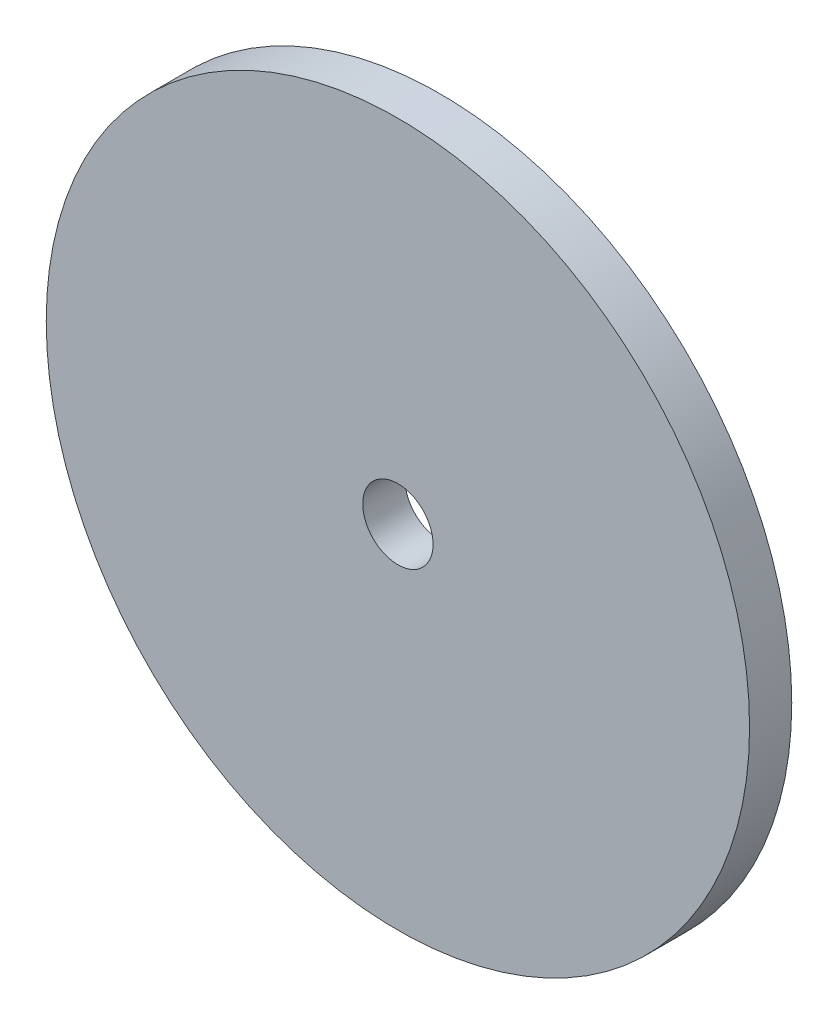
ISO-10303-21;
HEADER;
FILE_DESCRIPTION(('STEP AP214'),'2;1');
FILE_NAME('part.step','',(''),(''),'','','');
FILE_SCHEMA(('AUTOMOTIVE_DESIGN { 1 0 10303 214 1 1 1 1 }'));
ENDSEC;
DATA;
#1=APPLICATION_CONTEXT('core data for automotive mechanical design processes');
#2=APPLICATION_PROTOCOL_DEFINITION('international standard','automotive_design',2000,#1);
#3=PRODUCT_CONTEXT('',#1,'mechanical');
#4=PRODUCT('Part','Part','',(#3));
#5=PRODUCT_RELATED_PRODUCT_CATEGORY('part','',(#4));
#6=PRODUCT_DEFINITION_FORMATION('','',#4);
#7=PRODUCT_DEFINITION_CONTEXT('part definition',#1,'design');
#8=PRODUCT_DEFINITION('design','',#6,#7);
#9=PRODUCT_DEFINITION_SHAPE('','',#8);
#10=(LENGTH_UNIT() NAMED_UNIT(*) SI_UNIT(.MILLI.,.METRE.));
#11=(NAMED_UNIT(*) PLANE_ANGLE_UNIT() SI_UNIT($,.RADIAN.));
#12=(NAMED_UNIT(*) SI_UNIT($,.STERADIAN.) SOLID_ANGLE_UNIT());
#13=UNCERTAINTY_MEASURE_WITH_UNIT(LENGTH_MEASURE(1.E-05),#10,'distance_accuracy_value','');
#14=(GEOMETRIC_REPRESENTATION_CONTEXT(3) GLOBAL_UNCERTAINTY_ASSIGNED_CONTEXT((#13)) GLOBAL_UNIT_ASSIGNED_CONTEXT((#10,
#11,#12)) REPRESENTATION_CONTEXT('',''));
#15=CARTESIAN_POINT('',(0.,0.,0.));
#16=DIRECTION('',(0.,0.,1.));
#17=DIRECTION('',(1.,0.,0.));
#18=AXIS2_PLACEMENT_3D('',#15,#16,#17);
#19=CARTESIAN_POINT('',(0.,0.,3.));
#20=DIRECTION('',(0.,0.,-1.));
#21=DIRECTION('',(-1.,0.,0.));
#22=AXIS2_PLACEMENT_3D('',#19,#20,#21);
#23=CYLINDRICAL_SURFACE('',#22,25.);
#24=CARTESIAN_POINT('',(0.,0.,3.));
#25=DIRECTION('',(0.,0.,1.));
#26=DIRECTION('',(1.,0.,0.));
#27=AXIS2_PLACEMENT_3D('',#24,#25,#26);
#28=CIRCLE('',#27,25.);
#29=CARTESIAN_POINT('',(25.,0.,3.));
#30=VERTEX_POINT('',#29);
#31=EDGE_CURVE('E10',#30,#30,#28,.T.);
#32=ORIENTED_EDGE('',*,*,#31,.F.);
#33=EDGE_LOOP('',(#32));
#34=FACE_BOUND('',#33,.T.);
#35=CARTESIAN_POINT('',(0.,0.,0.));
#36=DIRECTION('',(0.,0.,1.));
#37=DIRECTION('',(1.,0.,0.));
#38=AXIS2_PLACEMENT_3D('',#35,#36,#37);
#39=CIRCLE('',#38,25.);
#40=CARTESIAN_POINT('',(25.,0.,0.));
#41=VERTEX_POINT('',#40);
#42=EDGE_CURVE('E50',#41,#41,#39,.T.);
#43=ORIENTED_EDGE('',*,*,#42,.T.);
#44=EDGE_LOOP('',(#43));
#45=FACE_BOUND('',#44,.T.);
#46=ADVANCED_FACE('F42',(#34,#45),#23,.T.);
#47=CARTESIAN_POINT('',(0.,0.,3.));
#48=DIRECTION('',(0.,0.,1.));
#49=DIRECTION('',(1.,0.,0.));
#50=AXIS2_PLACEMENT_3D('',#47,#48,#49);
#51=PLANE('',#50);
#52=CARTESIAN_POINT('',(0.,0.,3.));
#53=DIRECTION('',(0.,0.,1.));
#54=DIRECTION('',(1.,0.,0.));
#55=AXIS2_PLACEMENT_3D('',#52,#53,#54);
#56=CIRCLE('',#55,2.5);
#57=CARTESIAN_POINT('',(2.5,0.,3.));
#58=VERTEX_POINT('',#57);
#59=EDGE_CURVE('E57',#58,#58,#56,.T.);
#60=ORIENTED_EDGE('',*,*,#59,.F.);
#61=EDGE_LOOP('',(#60));
#62=FACE_BOUND('',#61,.T.);
#63=ORIENTED_EDGE('',*,*,#31,.T.);
#64=EDGE_LOOP('',(#63));
#65=FACE_BOUND('',#64,.T.);
#66=ADVANCED_FACE('F71',(#62,#65),#51,.T.);
#67=CARTESIAN_POINT('',(0.,0.,0.));
#68=DIRECTION('',(0.,0.,1.));
#69=DIRECTION('',(1.,0.,0.));
#70=AXIS2_PLACEMENT_3D('',#67,#68,#69);
#71=PLANE('',#70);
#72=CARTESIAN_POINT('',(0.,0.,0.));
#73=DIRECTION('',(0.,0.,1.));
#74=DIRECTION('',(1.,0.,0.));
#75=AXIS2_PLACEMENT_3D('',#72,#73,#74);
#76=CIRCLE('',#75,2.5);
#77=CARTESIAN_POINT('',(2.5,0.,0.));
#78=VERTEX_POINT('',#77);
#79=EDGE_CURVE('E45',#78,#78,#76,.F.);
#80=ORIENTED_EDGE('',*,*,#79,.F.);
#81=EDGE_LOOP('',(#80));
#82=FACE_BOUND('',#81,.T.);
#83=ORIENTED_EDGE('',*,*,#42,.F.);
#84=EDGE_LOOP('',(#83));
#85=FACE_BOUND('',#84,.T.);
#86=ADVANCED_FACE('F68',(#82,#85),#71,.F.);
#87=CARTESIAN_POINT('',(0.,0.,3.));
#88=DIRECTION('',(0.,0.,-1.));
#89=DIRECTION('',(-1.,0.,0.));
#90=AXIS2_PLACEMENT_3D('',#87,#88,#89);
#91=CYLINDRICAL_SURFACE('',#90,2.5);
#92=ORIENTED_EDGE('',*,*,#59,.T.);
#93=EDGE_LOOP('',(#92));
#94=FACE_BOUND('',#93,.T.);
#95=ORIENTED_EDGE('',*,*,#79,.T.);
#96=EDGE_LOOP('',(#95));
#97=FACE_BOUND('',#96,.T.);
#98=ADVANCED_FACE('F66',(#94,#97),#91,.F.);
#99=CLOSED_SHELL('',(#46,#66,#86,#98));
#100=MANIFOLD_SOLID_BREP('B2',#99);
#101=ADVANCED_BREP_SHAPE_REPRESENTATION('',(#18,#100),#14);
#102=SHAPE_DEFINITION_REPRESENTATION(#9,#101);
ENDSEC;
END-ISO-10303-21;
